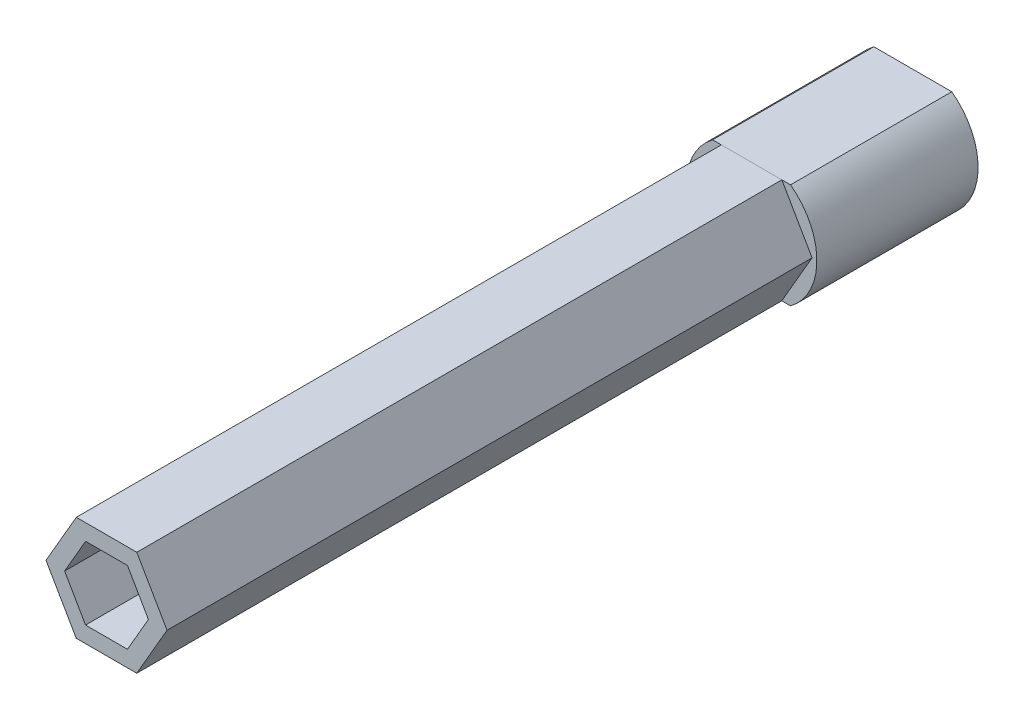
ISO-10303-21;
HEADER;
FILE_DESCRIPTION(('STEP AP214'),'2;1');
FILE_NAME('part.step','',(''),(''),'','','');
FILE_SCHEMA(('AUTOMOTIVE_DESIGN { 1 0 10303 214 1 1 1 1 }'));
ENDSEC;
DATA;
#1=APPLICATION_CONTEXT('core data for automotive mechanical design processes');
#2=APPLICATION_PROTOCOL_DEFINITION('international standard','automotive_design',2000,#1);
#3=PRODUCT_CONTEXT('',#1,'mechanical');
#4=PRODUCT('Part','Part','',(#3));
#5=PRODUCT_RELATED_PRODUCT_CATEGORY('part','',(#4));
#6=PRODUCT_DEFINITION_FORMATION('','',#4);
#7=PRODUCT_DEFINITION_CONTEXT('part definition',#1,'design');
#8=PRODUCT_DEFINITION('design','',#6,#7);
#9=PRODUCT_DEFINITION_SHAPE('','',#8);
#10=(LENGTH_UNIT() NAMED_UNIT(*) SI_UNIT(.MILLI.,.METRE.));
#11=(NAMED_UNIT(*) PLANE_ANGLE_UNIT() SI_UNIT($,.RADIAN.));
#12=(NAMED_UNIT(*) SI_UNIT($,.STERADIAN.) SOLID_ANGLE_UNIT());
#13=UNCERTAINTY_MEASURE_WITH_UNIT(LENGTH_MEASURE(1.E-05),#10,'distance_accuracy_value','');
#14=(GEOMETRIC_REPRESENTATION_CONTEXT(3) GLOBAL_UNCERTAINTY_ASSIGNED_CONTEXT((#13)) GLOBAL_UNIT_ASSIGNED_CONTEXT((#10,
#11,#12)) REPRESENTATION_CONTEXT('',''));
#15=CARTESIAN_POINT('',(0.,0.,0.));
#16=DIRECTION('',(0.,0.,1.));
#17=DIRECTION('',(1.,0.,0.));
#18=AXIS2_PLACEMENT_3D('',#15,#16,#17);
#19=CARTESIAN_POINT('',(0.,0.,10.));
#20=DIRECTION('',(0.,0.,1.));
#21=DIRECTION('',(1.,0.,0.));
#22=AXIS2_PLACEMENT_3D('',#19,#20,#21);
#23=PLANE('',#22);
#24=DIRECTION('',(0.500519628214266,0.865725188366524,0.));
#25=VECTOR('',#24,1.);
#26=CARTESIAN_POINT('',(1.29768760413523,-2.25077917221432,10.));
#27=LINE('',#26,#25);
#28=CARTESIAN_POINT('',(1.29768760413523,-2.25077917221432,10.));
#29=VERTEX_POINT('',#28);
#30=CARTESIAN_POINT('',(1.58721343572977,-1.75,10.));
#31=VERTEX_POINT('',#30);
#32=EDGE_CURVE('E255',#29,#31,#27,.T.);
#33=ORIENTED_EDGE('',*,*,#32,.T.);
#34=DIRECTION('',(-1.,0.,0.));
#35=VECTOR('',#34,1.);
#36=CARTESIAN_POINT('',(1.85472369909914,-1.75,10.));
#37=LINE('',#36,#35);
#38=CARTESIAN_POINT('',(-1.58821363394415,-1.75,10.));
#39=VERTEX_POINT('',#38);
#40=EDGE_CURVE('E216',#31,#39,#37,.T.);
#41=ORIENTED_EDGE('',*,*,#40,.T.);
#42=DIRECTION('',(0.499480191714345,-0.866325307309558,0.));
#43=VECTOR('',#42,1.);
#44=CARTESIAN_POINT('',(-2.59807574351413,0.00155915474988123,10.));
#45=LINE('',#44,#43);
#46=CARTESIAN_POINT('',(-1.30038813937889,-2.24922001746443,10.));
#47=VERTEX_POINT('',#46);
#48=EDGE_CURVE('E252',#39,#47,#45,.T.);
#49=ORIENTED_EDGE('',*,*,#48,.T.);
#50=DIRECTION('',(0.999999819928611,-0.000600118943034815,0.));
#51=VECTOR('',#50,1.);
#52=CARTESIAN_POINT('',(-1.30038813937889,-2.24922001746443,10.));
#53=LINE('',#52,#51);
#54=EDGE_CURVE('E273',#47,#29,#53,.T.);
#55=ORIENTED_EDGE('',*,*,#54,.T.);
#56=EDGE_LOOP('',(#33,#41,#49,#55));
#57=FACE_BOUND('',#56,.T.);
#58=ADVANCED_FACE('F45',(#57),#23,.T.);
#59=DIRECTION('',(-0.499480191714345,0.866325307309558,0.));
#60=VECTOR('',#59,1.);
#61=CARTESIAN_POINT('',(2.59807574351412,-0.00155915474988166,10.));
#62=LINE('',#61,#60);
#63=CARTESIAN_POINT('',(2.59807574351412,-0.00155915474988166,10.));
#64=VERTEX_POINT('',#63);
#65=CARTESIAN_POINT('',(2.54860817150372,0.084240062585808,10.));
#66=VERTEX_POINT('',#65);
#67=EDGE_CURVE('E283',#64,#66,#62,.T.);
#68=ORIENTED_EDGE('',*,*,#67,.T.);
#69=CARTESIAN_POINT('',(0.,0.,10.));
#70=DIRECTION('',(0.,0.,-1.));
#71=DIRECTION('',(-1.,0.,0.));
#72=AXIS2_PLACEMENT_3D('',#69,#70,#71);
#73=CIRCLE('',#72,2.55);
#74=CARTESIAN_POINT('',(2.5485052276818,-0.0872989374422718,10.));
#75=VERTEX_POINT('',#74);
#76=EDGE_CURVE('E675',#66,#75,#73,.T.);
#77=ORIENTED_EDGE('',*,*,#76,.T.);
#78=EDGE_CURVE('E276',#75,#64,#27,.T.);
#79=ORIENTED_EDGE('',*,*,#78,.T.);
#80=EDGE_LOOP('',(#68,#77,#79));
#81=FACE_BOUND('',#80,.T.);
#82=ADVANCED_FACE('F516',(#81),#23,.T.);
#83=DIRECTION('',(-0.500519628214266,-0.865725188366524,0.));
#84=VECTOR('',#83,1.);
#85=CARTESIAN_POINT('',(-1.29768760413523,2.25077917221431,10.));
#86=LINE('',#85,#84);
#87=CARTESIAN_POINT('',(-1.29768760413523,2.25077917221431,10.));
#88=VERTEX_POINT('',#87);
#89=CARTESIAN_POINT('',(-1.58721343572977,1.75,10.));
#90=VERTEX_POINT('',#89);
#91=EDGE_CURVE('E293',#88,#90,#86,.T.);
#92=ORIENTED_EDGE('',*,*,#91,.T.);
#93=DIRECTION('',(1.,0.,0.));
#94=VECTOR('',#93,1.);
#95=CARTESIAN_POINT('',(-1.85472369909914,1.75,10.));
#96=LINE('',#95,#94);
#97=CARTESIAN_POINT('',(1.58821363394415,1.75,10.));
#98=VERTEX_POINT('',#97);
#99=EDGE_CURVE('E236',#90,#98,#96,.T.);
#100=ORIENTED_EDGE('',*,*,#99,.T.);
#101=CARTESIAN_POINT('',(1.30038813937889,2.24922001746443,10.));
#102=VERTEX_POINT('',#101);
#103=EDGE_CURVE('E282',#98,#102,#62,.T.);
#104=ORIENTED_EDGE('',*,*,#103,.T.);
#105=DIRECTION('',(-0.999999819928611,0.000600118943034147,0.));
#106=VECTOR('',#105,1.);
#107=CARTESIAN_POINT('',(1.30038813937889,2.24922001746443,10.));
#108=LINE('',#107,#106);
#109=EDGE_CURVE('E287',#102,#88,#108,.T.);
#110=ORIENTED_EDGE('',*,*,#109,.T.);
#111=EDGE_LOOP('',(#92,#100,#104,#110));
#112=FACE_BOUND('',#111,.T.);
#113=ADVANCED_FACE('F523',(#112),#23,.T.);
#114=CARTESIAN_POINT('',(0.,0.,50.));
#115=DIRECTION('',(0.,0.,1.));
#116=DIRECTION('',(1.,0.,0.));
#117=AXIS2_PLACEMENT_3D('',#114,#115,#116);
#118=PLANE('',#117);
#119=DIRECTION('',(0.999999819928611,-0.000600118943034738,0.));
#120=VECTOR('',#119,1.);
#121=CARTESIAN_POINT('',(-1.87833842354729,-3.24887335855974,50.));
#122=LINE('',#121,#120);
#123=CARTESIAN_POINT('',(-1.87833842354729,-3.24887335855974,50.));
#124=VERTEX_POINT('',#123);
#125=CARTESIAN_POINT('',(1.87443765041756,-3.25112547097623,50.));
#126=VERTEX_POINT('',#125);
#127=EDGE_CURVE('E319',#124,#126,#122,.T.);
#128=ORIENTED_EDGE('',*,*,#127,.T.);
#129=DIRECTION('',(0.500519628214266,0.865725188366524,0.));
#130=VECTOR('',#129,1.);
#131=CARTESIAN_POINT('',(1.87443765041756,-3.25112547097623,50.));
#132=LINE('',#131,#130);
#133=CARTESIAN_POINT('',(3.75277607396485,-0.00225211241649553,50.));
#134=VERTEX_POINT('',#133);
#135=EDGE_CURVE('E323',#126,#134,#132,.T.);
#136=ORIENTED_EDGE('',*,*,#135,.T.);
#137=DIRECTION('',(-0.499480191714345,0.866325307309558,0.));
#138=VECTOR('',#137,1.);
#139=CARTESIAN_POINT('',(3.75277607396485,-0.00225211241649553,50.));
#140=LINE('',#139,#138);
#141=CARTESIAN_POINT('',(1.87833842354728,3.24887335855974,50.));
#142=VERTEX_POINT('',#141);
#143=EDGE_CURVE('E327',#134,#142,#140,.T.);
#144=ORIENTED_EDGE('',*,*,#143,.T.);
#145=DIRECTION('',(-0.999999819928611,0.000600118943034275,0.));
#146=VECTOR('',#145,1.);
#147=CARTESIAN_POINT('',(1.87833842354728,3.24887335855974,50.));
#148=LINE('',#147,#146);
#149=CARTESIAN_POINT('',(-1.87443765041756,3.25112547097623,50.));
#150=VERTEX_POINT('',#149);
#151=EDGE_CURVE('E330',#142,#150,#148,.T.);
#152=ORIENTED_EDGE('',*,*,#151,.T.);
#153=DIRECTION('',(-0.500519628214266,-0.865725188366524,0.));
#154=VECTOR('',#153,1.);
#155=CARTESIAN_POINT('',(-1.87443765041756,3.25112547097623,50.));
#156=LINE('',#155,#154);
#157=CARTESIAN_POINT('',(-3.75277607396485,0.0022521124164951,50.));
#158=VERTEX_POINT('',#157);
#159=EDGE_CURVE('E333',#150,#158,#156,.T.);
#160=ORIENTED_EDGE('',*,*,#159,.T.);
#161=DIRECTION('',(0.499480191714345,-0.866325307309558,0.));
#162=VECTOR('',#161,1.);
#163=CARTESIAN_POINT('',(-3.75277607396485,0.0022521124164951,50.));
#164=LINE('',#163,#162);
#165=EDGE_CURVE('E336',#158,#124,#164,.T.);
#166=ORIENTED_EDGE('',*,*,#165,.T.);
#167=EDGE_LOOP('',(#128,#136,#144,#152,#160,#166));
#168=FACE_BOUND('',#167,.T.);
#169=DIRECTION('',(-0.999999819928611,0.000600118943034815,0.));
#170=VECTOR('',#169,1.);
#171=CARTESIAN_POINT('',(-0.00135026762182833,-2.24999959483937,50.));
#172=LINE('',#171,#170);
#173=CARTESIAN_POINT('',(1.29768760413523,-2.25077917221432,50.));
#174=VERTEX_POINT('',#173);
#175=CARTESIAN_POINT('',(-1.30038813937889,-2.24922001746443,50.));
#176=VERTEX_POINT('',#175);
#177=EDGE_CURVE('E54',#174,#176,#172,.T.);
#178=ORIENTED_EDGE('',*,*,#177,.T.);
#179=DIRECTION('',(-0.499480191714345,0.866325307309558,0.));
#180=VECTOR('',#179,1.);
#181=CARTESIAN_POINT('',(-1.94923194144651,-1.12383043135728,50.));
#182=LINE('',#181,#180);
#183=CARTESIAN_POINT('',(-2.59807574351413,0.00155915474988123,50.));
#184=VERTEX_POINT('',#183);
#185=EDGE_CURVE('E11',#176,#184,#182,.T.);
#186=ORIENTED_EDGE('',*,*,#185,.T.);
#187=DIRECTION('',(0.500519628214266,0.865725188366524,0.));
#188=VECTOR('',#187,1.);
#189=CARTESIAN_POINT('',(-1.94788167382468,1.1261691634821,50.));
#190=LINE('',#189,#188);
#191=CARTESIAN_POINT('',(-1.29768760413523,2.25077917221431,50.));
#192=VERTEX_POINT('',#191);
#193=EDGE_CURVE('E415',#184,#192,#190,.T.);
#194=ORIENTED_EDGE('',*,*,#193,.T.);
#195=DIRECTION('',(0.999999819928611,-0.000600118943034147,0.));
#196=VECTOR('',#195,1.);
#197=CARTESIAN_POINT('',(0.00135026762182683,2.24999959483937,50.));
#198=LINE('',#197,#196);
#199=CARTESIAN_POINT('',(1.30038813937889,2.24922001746443,50.));
#200=VERTEX_POINT('',#199);
#201=EDGE_CURVE('E572',#192,#200,#198,.T.);
#202=ORIENTED_EDGE('',*,*,#201,.T.);
#203=DIRECTION('',(0.499480191714345,-0.866325307309558,0.));
#204=VECTOR('',#203,1.);
#205=CARTESIAN_POINT('',(1.94923194144651,1.12383043135728,50.));
#206=LINE('',#205,#204);
#207=CARTESIAN_POINT('',(2.59807574351412,-0.00155915474988166,50.));
#208=VERTEX_POINT('',#207);
#209=EDGE_CURVE('E568',#200,#208,#206,.T.);
#210=ORIENTED_EDGE('',*,*,#209,.T.);
#211=DIRECTION('',(-0.500519628214266,-0.865725188366524,0.));
#212=VECTOR('',#211,1.);
#213=CARTESIAN_POINT('',(1.94788167382468,-1.1261691634821,50.));
#214=LINE('',#213,#212);
#215=EDGE_CURVE('E563',#208,#174,#214,.T.);
#216=ORIENTED_EDGE('',*,*,#215,.T.);
#217=EDGE_LOOP('',(#178,#186,#194,#202,#210,#216));
#218=FACE_BOUND('',#217,.T.);
#219=ADVANCED_FACE('F539',(#168,#218),#118,.T.);
#220=CARTESIAN_POINT('',(0.,0.,10.));
#221=DIRECTION('',(0.,0.,1.));
#222=DIRECTION('',(1.,0.,0.));
#223=AXIS2_PLACEMENT_3D('',#220,#221,#222);
#224=PLANE('',#223);
#225=DIRECTION('',(0.499480191714345,-0.866325307309558,0.));
#226=VECTOR('',#225,1.);
#227=CARTESIAN_POINT('',(-3.75277607396485,0.0022521124164951,10.));
#228=LINE('',#227,#226);
#229=CARTESIAN_POINT('',(-3.75277607396485,0.00225211241649571,10.));
#230=VERTEX_POINT('',#229);
#231=CARTESIAN_POINT('',(-1.87813105049792,-3.24959271649905,10.));
#232=VERTEX_POINT('',#231);
#233=EDGE_CURVE('E324',#230,#232,#228,.T.);
#234=ORIENTED_EDGE('',*,*,#233,.F.);
#235=DIRECTION('',(-0.500519628214266,-0.865725188366524,0.));
#236=VECTOR('',#235,1.);
#237=CARTESIAN_POINT('',(-1.87443765041756,3.25112547097623,10.));
#238=LINE('',#237,#236);
#239=CARTESIAN_POINT('',(-1.87464549846826,3.25040646104057,10.));
#240=VERTEX_POINT('',#239);
#241=EDGE_CURVE('E605',#240,#230,#238,.T.);
#242=ORIENTED_EDGE('',*,*,#241,.F.);
#243=CARTESIAN_POINT('',(-1.87476299633689,3.25,10.));
#244=DIRECTION('',(-1.,0.,0.));
#245=VECTOR('',#244,1.);
#246=LINE('',#243,#245);
#247=CARTESIAN_POINT('',(-2.41660919471891,3.25,10.));
#248=VERTEX_POINT('',#247);
#249=EDGE_CURVE('E409',#240,#248,#246,.T.);
#250=ORIENTED_EDGE('',*,*,#249,.T.);
#251=CARTESIAN_POINT('',(0.,0.,10.));
#252=DIRECTION('',(0.,0.,1.));
#253=DIRECTION('',(1.,0.,0.));
#254=AXIS2_PLACEMENT_3D('',#251,#252,#253);
#255=CIRCLE('',#254,4.05);
#256=CARTESIAN_POINT('',(-2.41660919471891,-3.25,10.));
#257=VERTEX_POINT('',#256);
#258=EDGE_CURVE('E443',#248,#257,#255,.T.);
#259=ORIENTED_EDGE('',*,*,#258,.T.);
#260=CARTESIAN_POINT('',(-2.41660919471891,-3.25,10.));
#261=DIRECTION('',(1.,0.,0.));
#262=VECTOR('',#261,1.);
#263=LINE('',#260,#262);
#264=EDGE_CURVE('E466',#257,#232,#263,.T.);
#265=ORIENTED_EDGE('',*,*,#264,.T.);
#266=EDGE_LOOP('',(#234,#242,#250,#259,#265));
#267=FACE_BOUND('',#266,.T.);
#268=ADVANCED_FACE('F380',(#267),#224,.T.);
#269=CARTESIAN_POINT('',(0.,0.,10.));
#270=DIRECTION('',(0.,0.,-1.));
#271=DIRECTION('',(-1.,0.,0.));
#272=AXIS2_PLACEMENT_3D('',#269,#270,#271);
#273=CYLINDRICAL_SURFACE('',#272,4.05);
#274=CARTESIAN_POINT('',(0.,0.,0.));
#275=DIRECTION('',(0.,0.,1.));
#276=DIRECTION('',(1.,0.,0.));
#277=AXIS2_PLACEMENT_3D('',#274,#275,#276);
#278=CIRCLE('',#277,4.05);
#279=CARTESIAN_POINT('',(-2.41660919471891,3.25,0.));
#280=VERTEX_POINT('',#279);
#281=CARTESIAN_POINT('',(-2.41660919471891,-3.25,0.));
#282=VERTEX_POINT('',#281);
#283=EDGE_CURVE('E473',#280,#282,#278,.T.);
#284=ORIENTED_EDGE('',*,*,#283,.T.);
#285=DIRECTION('',(0.,0.,-1.));
#286=VECTOR('',#285,1.);
#287=CARTESIAN_POINT('',(-2.41660919471891,-3.25,10.));
#288=LINE('',#287,#286);
#289=EDGE_CURVE('E575',#257,#282,#288,.T.);
#290=ORIENTED_EDGE('',*,*,#289,.F.);
#291=ORIENTED_EDGE('',*,*,#258,.F.);
#292=DIRECTION('',(0.,0.,-1.));
#293=VECTOR('',#292,1.);
#294=CARTESIAN_POINT('',(-2.41660919471891,3.25,10.));
#295=LINE('',#294,#293);
#296=EDGE_CURVE('E635',#248,#280,#295,.T.);
#297=ORIENTED_EDGE('',*,*,#296,.T.);
#298=EDGE_LOOP('',(#284,#290,#291,#297));
#299=FACE_BOUND('',#298,.T.);
#300=ADVANCED_FACE('F47',(#299),#273,.T.);
#301=CARTESIAN_POINT('',(-2.41660919471891,-3.25,10.));
#302=DIRECTION('',(0.,1.,0.));
#303=DIRECTION('',(0.,0.,1.));
#304=AXIS2_PLACEMENT_3D('',#301,#302,#303);
#305=PLANE('',#304);
#306=DIRECTION('',(1.,0.,0.));
#307=VECTOR('',#306,1.);
#308=CARTESIAN_POINT('',(-2.41660919471891,-3.25,0.));
#309=LINE('',#308,#307);
#310=CARTESIAN_POINT('',(2.41660919471891,-3.25,0.));
#311=VERTEX_POINT('',#310);
#312=EDGE_CURVE('E477',#282,#311,#309,.T.);
#313=ORIENTED_EDGE('',*,*,#312,.T.);
#314=DIRECTION('',(0.,0.,-1.));
#315=VECTOR('',#314,1.);
#316=CARTESIAN_POINT('',(2.41660919471891,-3.25,10.));
#317=LINE('',#316,#315);
#318=CARTESIAN_POINT('',(2.41660919471891,-3.25,10.));
#319=VERTEX_POINT('',#318);
#320=EDGE_CURVE('E463',#319,#311,#317,.T.);
#321=ORIENTED_EDGE('',*,*,#320,.F.);
#322=CARTESIAN_POINT('',(1.87476299633689,-3.25,10.));
#323=DIRECTION('',(1.,0.,0.));
#324=VECTOR('',#323,1.);
#325=LINE('',#322,#324);
#326=CARTESIAN_POINT('',(1.87464549846826,-3.25040646104057,10.));
#327=VERTEX_POINT('',#326);
#328=EDGE_CURVE('E459',#327,#319,#325,.T.);
#329=ORIENTED_EDGE('',*,*,#328,.F.);
#330=CARTESIAN_POINT('',(-1.87833842354729,-3.24887335855974,9.99999999999999));
#331=DIRECTION('',(0.999999819928611,-0.000600118943034738,0.));
#332=VECTOR('',#331,1.);
#333=LINE('',#330,#332);
#334=EDGE_CURVE('E318',#232,#327,#333,.T.);
#335=ORIENTED_EDGE('',*,*,#334,.F.);
#336=ORIENTED_EDGE('',*,*,#264,.F.);
#337=ORIENTED_EDGE('',*,*,#289,.T.);
#338=EDGE_LOOP('',(#313,#321,#329,#335,#336,#337));
#339=FACE_BOUND('',#338,.T.);
#340=ADVANCED_FACE('F434',(#339),#305,.F.);
#341=CARTESIAN_POINT('',(0.,0.,10.));
#342=DIRECTION('',(0.,0.,-1.));
#343=DIRECTION('',(-1.,0.,0.));
#344=AXIS2_PLACEMENT_3D('',#341,#342,#343);
#345=CYLINDRICAL_SURFACE('',#344,4.05);
#346=CARTESIAN_POINT('',(0.,0.,0.));
#347=DIRECTION('',(0.,0.,1.));
#348=DIRECTION('',(1.,0.,0.));
#349=AXIS2_PLACEMENT_3D('',#346,#347,#348);
#350=CIRCLE('',#349,4.05);
#351=CARTESIAN_POINT('',(2.41660919471891,3.25,0.));
#352=VERTEX_POINT('',#351);
#353=EDGE_CURVE('E627',#311,#352,#350,.T.);
#354=ORIENTED_EDGE('',*,*,#353,.T.);
#355=DIRECTION('',(0.,0.,-1.));
#356=VECTOR('',#355,1.);
#357=CARTESIAN_POINT('',(2.41660919471891,3.25,10.));
#358=LINE('',#357,#356);
#359=CARTESIAN_POINT('',(2.41660919471891,3.25,10.));
#360=VERTEX_POINT('',#359);
#361=EDGE_CURVE('E420',#360,#352,#358,.T.);
#362=ORIENTED_EDGE('',*,*,#361,.F.);
#363=CARTESIAN_POINT('',(0.,0.,10.));
#364=DIRECTION('',(0.,0.,1.));
#365=DIRECTION('',(1.,0.,0.));
#366=AXIS2_PLACEMENT_3D('',#363,#364,#365);
#367=CIRCLE('',#366,4.05);
#368=EDGE_CURVE('E588',#319,#360,#367,.T.);
#369=ORIENTED_EDGE('',*,*,#368,.F.);
#370=ORIENTED_EDGE('',*,*,#320,.T.);
#371=EDGE_LOOP('',(#354,#362,#369,#370));
#372=FACE_BOUND('',#371,.T.);
#373=ADVANCED_FACE('F432',(#372),#345,.T.);
#374=CARTESIAN_POINT('',(-2.41660919471891,3.25,10.));
#375=DIRECTION('',(0.,-1.,0.));
#376=DIRECTION('',(0.,0.,-1.));
#377=AXIS2_PLACEMENT_3D('',#374,#375,#376);
#378=PLANE('',#377);
#379=DIRECTION('',(-1.,0.,0.));
#380=VECTOR('',#379,1.);
#381=CARTESIAN_POINT('',(-2.41660919471891,3.25,0.));
#382=LINE('',#381,#380);
#383=EDGE_CURVE('E629',#352,#280,#382,.T.);
#384=ORIENTED_EDGE('',*,*,#383,.T.);
#385=ORIENTED_EDGE('',*,*,#296,.F.);
#386=ORIENTED_EDGE('',*,*,#249,.F.);
#387=CARTESIAN_POINT('',(1.87833842354728,3.24887335855974,9.99999999999999));
#388=DIRECTION('',(-0.999999819928611,0.000600118943034275,0.));
#389=VECTOR('',#388,1.);
#390=LINE('',#387,#389);
#391=CARTESIAN_POINT('',(1.87813105049792,3.24959271649905,10.));
#392=VERTEX_POINT('',#391);
#393=EDGE_CURVE('E489',#392,#240,#390,.T.);
#394=ORIENTED_EDGE('',*,*,#393,.F.);
#395=CARTESIAN_POINT('',(2.41660919471891,3.25,10.));
#396=DIRECTION('',(-1.,0.,0.));
#397=VECTOR('',#396,1.);
#398=LINE('',#395,#397);
#399=EDGE_CURVE('E594',#360,#392,#398,.T.);
#400=ORIENTED_EDGE('',*,*,#399,.F.);
#401=ORIENTED_EDGE('',*,*,#361,.T.);
#402=EDGE_LOOP('',(#384,#385,#386,#394,#400,#401));
#403=FACE_BOUND('',#402,.T.);
#404=ADVANCED_FACE('F378',(#403),#378,.F.);
#405=DIRECTION('',(-0.499480191714345,0.866325307309558,0.));
#406=VECTOR('',#405,1.);
#407=CARTESIAN_POINT('',(3.75277607396485,-0.00225211241649553,10.));
#408=LINE('',#407,#406);
#409=CARTESIAN_POINT('',(3.75277607396485,-0.00225211241649553,10.));
#410=VERTEX_POINT('',#409);
#411=EDGE_CURVE('E495',#410,#392,#408,.T.);
#412=ORIENTED_EDGE('',*,*,#411,.F.);
#413=DIRECTION('',(0.500519628214266,0.865725188366524,0.));
#414=VECTOR('',#413,1.);
#415=CARTESIAN_POINT('',(1.87443765041756,-3.25112547097623,10.));
#416=LINE('',#415,#414);
#417=EDGE_CURVE('E470',#327,#410,#416,.T.);
#418=ORIENTED_EDGE('',*,*,#417,.F.);
#419=ORIENTED_EDGE('',*,*,#328,.T.);
#420=ORIENTED_EDGE('',*,*,#368,.T.);
#421=ORIENTED_EDGE('',*,*,#399,.T.);
#422=EDGE_LOOP('',(#412,#418,#419,#420,#421));
#423=FACE_BOUND('',#422,.T.);
#424=ADVANCED_FACE('F374',(#423),#224,.T.);
#425=CARTESIAN_POINT('',(0.,0.,0.));
#426=DIRECTION('',(0.,0.,1.));
#427=DIRECTION('',(1.,0.,0.));
#428=AXIS2_PLACEMENT_3D('',#425,#426,#427);
#429=PLANE('',#428);
#430=CARTESIAN_POINT('',(0.,0.,0.));
#431=DIRECTION('',(0.,0.,-1.));
#432=DIRECTION('',(-1.,0.,0.));
#433=AXIS2_PLACEMENT_3D('',#430,#431,#432);
#434=CIRCLE('',#433,2.55);
#435=CARTESIAN_POINT('',(-1.85472369909914,-1.75,0.));
#436=VERTEX_POINT('',#435);
#437=CARTESIAN_POINT('',(-1.85472369909914,1.75,0.));
#438=VERTEX_POINT('',#437);
#439=EDGE_CURVE('E648',#436,#438,#434,.T.);
#440=ORIENTED_EDGE('',*,*,#439,.F.);
#441=DIRECTION('',(-1.,0.,0.));
#442=VECTOR('',#441,1.);
#443=CARTESIAN_POINT('',(1.85472369909914,-1.75,0.));
#444=LINE('',#443,#442);
#445=CARTESIAN_POINT('',(1.85472369909914,-1.75,0.));
#446=VERTEX_POINT('',#445);
#447=EDGE_CURVE('E69',#446,#436,#444,.T.);
#448=ORIENTED_EDGE('',*,*,#447,.F.);
#449=CARTESIAN_POINT('',(0.,0.,0.));
#450=DIRECTION('',(0.,0.,-1.));
#451=DIRECTION('',(-1.,0.,0.));
#452=AXIS2_PLACEMENT_3D('',#449,#450,#451);
#453=CIRCLE('',#452,2.55);
#454=CARTESIAN_POINT('',(1.85472369909914,1.75,0.));
#455=VERTEX_POINT('',#454);
#456=EDGE_CURVE('E217',#455,#446,#453,.T.);
#457=ORIENTED_EDGE('',*,*,#456,.F.);
#458=DIRECTION('',(1.,0.,0.));
#459=VECTOR('',#458,1.);
#460=CARTESIAN_POINT('',(-1.85472369909914,1.75,0.));
#461=LINE('',#460,#459);
#462=EDGE_CURVE('E651',#438,#455,#461,.T.);
#463=ORIENTED_EDGE('',*,*,#462,.F.);
#464=EDGE_LOOP('',(#440,#448,#457,#463));
#465=FACE_BOUND('',#464,.T.);
#466=ORIENTED_EDGE('',*,*,#283,.F.);
#467=ORIENTED_EDGE('',*,*,#383,.F.);
#468=ORIENTED_EDGE('',*,*,#353,.F.);
#469=ORIENTED_EDGE('',*,*,#312,.F.);
#470=EDGE_LOOP('',(#466,#467,#468,#469));
#471=FACE_BOUND('',#470,.T.);
#472=ADVANCED_FACE('F372',(#465,#471),#429,.F.);
#473=CARTESIAN_POINT('',(-1.87833842354729,-3.24887335855974,50.));
#474=DIRECTION('',(0.000600118943034738,0.999999819928611,0.));
#475=DIRECTION('',(-0.999999819928611,0.000600118943034738,0.));
#476=AXIS2_PLACEMENT_3D('',#473,#474,#475);
#477=PLANE('',#476);
#478=ORIENTED_EDGE('',*,*,#334,.T.);
#479=DIRECTION('',(0.,0.,-1.));
#480=VECTOR('',#479,1.);
#481=CARTESIAN_POINT('',(1.87443765041756,-3.25112547097623,50.));
#482=LINE('',#481,#480);
#483=EDGE_CURVE('E349',#126,#327,#482,.T.);
#484=ORIENTED_EDGE('',*,*,#483,.F.);
#485=ORIENTED_EDGE('',*,*,#127,.F.);
#486=DIRECTION('',(0.,0.,-1.));
#487=VECTOR('',#486,1.);
#488=CARTESIAN_POINT('',(-1.87833842354729,-3.24887335855974,50.));
#489=LINE('',#488,#487);
#490=EDGE_CURVE('E339',#124,#232,#489,.T.);
#491=ORIENTED_EDGE('',*,*,#490,.T.);
#492=EDGE_LOOP('',(#478,#484,#485,#491));
#493=FACE_BOUND('',#492,.T.);
#494=ADVANCED_FACE('F361',(#493),#477,.F.);
#495=CARTESIAN_POINT('',(1.87443765041756,-3.25112547097623,50.));
#496=DIRECTION('',(-0.865725188366524,0.500519628214266,0.));
#497=DIRECTION('',(-0.500519628214266,-0.865725188366524,0.));
#498=AXIS2_PLACEMENT_3D('',#495,#496,#497);
#499=PLANE('',#498);
#500=ORIENTED_EDGE('',*,*,#417,.T.);
#501=DIRECTION('',(0.,0.,-1.));
#502=VECTOR('',#501,1.);
#503=CARTESIAN_POINT('',(3.75277607396485,-0.00225211241649553,50.));
#504=LINE('',#503,#502);
#505=EDGE_CURVE('E345',#134,#410,#504,.T.);
#506=ORIENTED_EDGE('',*,*,#505,.F.);
#507=ORIENTED_EDGE('',*,*,#135,.F.);
#508=ORIENTED_EDGE('',*,*,#483,.T.);
#509=EDGE_LOOP('',(#500,#506,#507,#508));
#510=FACE_BOUND('',#509,.T.);
#511=ADVANCED_FACE('F371',(#510),#499,.F.);
#512=CARTESIAN_POINT('',(3.75277607396485,-0.00225211241649553,50.));
#513=DIRECTION('',(-0.866325307309558,-0.499480191714345,0.));
#514=DIRECTION('',(0.499480191714345,-0.866325307309559,0.));
#515=AXIS2_PLACEMENT_3D('',#512,#513,#514);
#516=PLANE('',#515);
#517=ORIENTED_EDGE('',*,*,#411,.T.);
#518=DIRECTION('',(0.,0.,-1.));
#519=VECTOR('',#518,1.);
#520=CARTESIAN_POINT('',(1.87833842354728,3.24887335855974,50.));
#521=LINE('',#520,#519);
#522=EDGE_CURVE('E350',#142,#392,#521,.T.);
#523=ORIENTED_EDGE('',*,*,#522,.F.);
#524=ORIENTED_EDGE('',*,*,#143,.F.);
#525=ORIENTED_EDGE('',*,*,#505,.T.);
#526=EDGE_LOOP('',(#517,#523,#524,#525));
#527=FACE_BOUND('',#526,.T.);
#528=ADVANCED_FACE('F507',(#527),#516,.F.);
#529=CARTESIAN_POINT('',(1.87833842354728,3.24887335855974,50.));
#530=DIRECTION('',(-0.000600118943034275,-0.999999819928611,0.));
#531=DIRECTION('',(0.999999819928611,-0.000600118943034275,0.));
#532=AXIS2_PLACEMENT_3D('',#529,#530,#531);
#533=PLANE('',#532);
#534=ORIENTED_EDGE('',*,*,#393,.T.);
#535=DIRECTION('',(0.,0.,-1.));
#536=VECTOR('',#535,1.);
#537=CARTESIAN_POINT('',(-1.87443765041756,3.25112547097623,50.));
#538=LINE('',#537,#536);
#539=EDGE_CURVE('E344',#150,#240,#538,.T.);
#540=ORIENTED_EDGE('',*,*,#539,.F.);
#541=ORIENTED_EDGE('',*,*,#151,.F.);
#542=ORIENTED_EDGE('',*,*,#522,.T.);
#543=EDGE_LOOP('',(#534,#540,#541,#542));
#544=FACE_BOUND('',#543,.T.);
#545=ADVANCED_FACE('F497',(#544),#533,.F.);
#546=CARTESIAN_POINT('',(-1.87443765041756,3.25112547097623,50.));
#547=DIRECTION('',(0.865725188366524,-0.500519628214266,0.));
#548=DIRECTION('',(0.500519628214266,0.865725188366524,0.));
#549=AXIS2_PLACEMENT_3D('',#546,#547,#548);
#550=PLANE('',#549);
#551=ORIENTED_EDGE('',*,*,#241,.T.);
#552=DIRECTION('',(0.,0.,-1.));
#553=VECTOR('',#552,1.);
#554=CARTESIAN_POINT('',(-3.75277607396485,0.0022521124164951,50.));
#555=LINE('',#554,#553);
#556=EDGE_CURVE('E340',#158,#230,#555,.T.);
#557=ORIENTED_EDGE('',*,*,#556,.F.);
#558=ORIENTED_EDGE('',*,*,#159,.F.);
#559=ORIENTED_EDGE('',*,*,#539,.T.);
#560=EDGE_LOOP('',(#551,#557,#558,#559));
#561=FACE_BOUND('',#560,.T.);
#562=ADVANCED_FACE('F506',(#561),#550,.F.);
#563=CARTESIAN_POINT('',(-3.75277607396485,0.0022521124164951,50.));
#564=DIRECTION('',(0.866325307309558,0.499480191714345,0.));
#565=DIRECTION('',(-0.499480191714345,0.866325307309559,0.));
#566=AXIS2_PLACEMENT_3D('',#563,#564,#565);
#567=PLANE('',#566);
#568=ORIENTED_EDGE('',*,*,#233,.T.);
#569=ORIENTED_EDGE('',*,*,#490,.F.);
#570=ORIENTED_EDGE('',*,*,#165,.F.);
#571=ORIENTED_EDGE('',*,*,#556,.T.);
#572=EDGE_LOOP('',(#568,#569,#570,#571));
#573=FACE_BOUND('',#572,.T.);
#574=ADVANCED_FACE('F601',(#573),#567,.F.);
#575=CARTESIAN_POINT('',(-2.59807574351413,0.00155915474988123,50.000025));
#576=DIRECTION('',(0.866325307309558,0.499480191714345,0.));
#577=DIRECTION('',(-0.499480191714345,0.866325307309558,0.));
#578=AXIS2_PLACEMENT_3D('',#575,#576,#577);
#579=PLANE('',#578);
#580=DIRECTION('',(0.,0.,-1.));
#581=VECTOR('',#580,1.);
#582=CARTESIAN_POINT('',(-1.30038813937889,-2.24922001746443,50.000025));
#583=LINE('',#582,#581);
#584=EDGE_CURVE('E261',#176,#47,#583,.T.);
#585=ORIENTED_EDGE('',*,*,#584,.T.);
#586=ORIENTED_EDGE('',*,*,#48,.F.);
#587=CARTESIAN_POINT('',(-2.54860817150372,-0.0842400625858095,10.));
#588=VERTEX_POINT('',#587);
#589=EDGE_CURVE('E213',#588,#39,#45,.T.);
#590=ORIENTED_EDGE('',*,*,#589,.F.);
#591=CARTESIAN_POINT('',(-2.59807574351413,0.00155915474988123,10.));
#592=VERTEX_POINT('',#591);
#593=EDGE_CURVE('E266',#592,#588,#45,.T.);
#594=ORIENTED_EDGE('',*,*,#593,.F.);
#595=DIRECTION('',(0.,0.,-1.));
#596=VECTOR('',#595,1.);
#597=CARTESIAN_POINT('',(-2.59807574351413,0.00155915474988123,50.000025));
#598=LINE('',#597,#596);
#599=EDGE_CURVE('E297',#184,#592,#598,.T.);
#600=ORIENTED_EDGE('',*,*,#599,.F.);
#601=ORIENTED_EDGE('',*,*,#185,.F.);
#602=EDGE_LOOP('',(#585,#586,#590,#594,#600,#601));
#603=FACE_BOUND('',#602,.T.);
#604=ADVANCED_FACE('F257',(#603),#579,.T.);
#605=CARTESIAN_POINT('',(-1.30038813937889,-2.24922001746443,50.000025));
#606=DIRECTION('',(0.000600118943034815,0.999999819928611,0.));
#607=DIRECTION('',(-0.999999819928611,0.000600118943034815,0.));
#608=AXIS2_PLACEMENT_3D('',#605,#606,#607);
#609=PLANE('',#608);
#610=DIRECTION('',(0.,0.,-1.));
#611=VECTOR('',#610,1.);
#612=CARTESIAN_POINT('',(1.29768760413523,-2.25077917221432,50.000025));
#613=LINE('',#612,#611);
#614=EDGE_CURVE('E313',#174,#29,#613,.T.);
#615=ORIENTED_EDGE('',*,*,#614,.T.);
#616=ORIENTED_EDGE('',*,*,#54,.F.);
#617=ORIENTED_EDGE('',*,*,#584,.F.);
#618=ORIENTED_EDGE('',*,*,#177,.F.);
#619=EDGE_LOOP('',(#615,#616,#617,#618));
#620=FACE_BOUND('',#619,.T.);
#621=ADVANCED_FACE('F705',(#620),#609,.T.);
#622=CARTESIAN_POINT('',(1.29768760413523,-2.25077917221432,50.000025));
#623=DIRECTION('',(-0.865725188366523,0.500519628214266,0.));
#624=DIRECTION('',(-0.500519628214266,-0.865725188366524,0.));
#625=AXIS2_PLACEMENT_3D('',#622,#623,#624);
#626=PLANE('',#625);
#627=DIRECTION('',(0.,0.,-1.));
#628=VECTOR('',#627,1.);
#629=CARTESIAN_POINT('',(2.59807574351412,-0.00155915474988166,50.000025));
#630=LINE('',#629,#628);
#631=EDGE_CURVE('E309',#208,#64,#630,.T.);
#632=ORIENTED_EDGE('',*,*,#631,.T.);
#633=ORIENTED_EDGE('',*,*,#78,.F.);
#634=EDGE_CURVE('E278',#31,#75,#27,.T.);
#635=ORIENTED_EDGE('',*,*,#634,.F.);
#636=ORIENTED_EDGE('',*,*,#32,.F.);
#637=ORIENTED_EDGE('',*,*,#614,.F.);
#638=ORIENTED_EDGE('',*,*,#215,.F.);
#639=EDGE_LOOP('',(#632,#633,#635,#636,#637,#638));
#640=FACE_BOUND('',#639,.T.);
#641=ADVANCED_FACE('F688',(#640),#626,.T.);
#642=CARTESIAN_POINT('',(2.59807574351412,-0.00155915474988166,50.000025));
#643=DIRECTION('',(-0.866325307309558,-0.499480191714345,0.));
#644=DIRECTION('',(0.499480191714345,-0.866325307309558,0.));
#645=AXIS2_PLACEMENT_3D('',#642,#643,#644);
#646=PLANE('',#645);
#647=DIRECTION('',(0.,0.,-1.));
#648=VECTOR('',#647,1.);
#649=CARTESIAN_POINT('',(1.30038813937889,2.24922001746443,50.000025));
#650=LINE('',#649,#648);
#651=EDGE_CURVE('E305',#200,#102,#650,.T.);
#652=ORIENTED_EDGE('',*,*,#651,.T.);
#653=ORIENTED_EDGE('',*,*,#103,.F.);
#654=EDGE_CURVE('E288',#66,#98,#62,.T.);
#655=ORIENTED_EDGE('',*,*,#654,.F.);
#656=ORIENTED_EDGE('',*,*,#67,.F.);
#657=ORIENTED_EDGE('',*,*,#631,.F.);
#658=ORIENTED_EDGE('',*,*,#209,.F.);
#659=EDGE_LOOP('',(#652,#653,#655,#656,#657,#658));
#660=FACE_BOUND('',#659,.T.);
#661=ADVANCED_FACE('F691',(#660),#646,.T.);
#662=CARTESIAN_POINT('',(1.30038813937889,2.24922001746443,50.000025));
#663=DIRECTION('',(-0.000600118943034147,-0.999999819928611,0.));
#664=DIRECTION('',(0.999999819928611,-0.000600118943034147,0.));
#665=AXIS2_PLACEMENT_3D('',#662,#663,#664);
#666=PLANE('',#665);
#667=DIRECTION('',(0.,0.,-1.));
#668=VECTOR('',#667,1.);
#669=CARTESIAN_POINT('',(-1.29768760413523,2.25077917221431,50.000025));
#670=LINE('',#669,#668);
#671=EDGE_CURVE('E302',#192,#88,#670,.T.);
#672=ORIENTED_EDGE('',*,*,#671,.T.);
#673=ORIENTED_EDGE('',*,*,#109,.F.);
#674=ORIENTED_EDGE('',*,*,#651,.F.);
#675=ORIENTED_EDGE('',*,*,#201,.F.);
#676=EDGE_LOOP('',(#672,#673,#674,#675));
#677=FACE_BOUND('',#676,.T.);
#678=ADVANCED_FACE('F536',(#677),#666,.T.);
#679=CARTESIAN_POINT('',(-1.29768760413523,2.25077917221431,50.000025));
#680=DIRECTION('',(0.865725188366524,-0.500519628214266,0.));
#681=DIRECTION('',(0.500519628214266,0.865725188366524,0.));
#682=AXIS2_PLACEMENT_3D('',#679,#680,#681);
#683=PLANE('',#682);
#684=ORIENTED_EDGE('',*,*,#599,.T.);
#685=CARTESIAN_POINT('',(-2.5485052276818,0.0872989374422735,10.));
#686=VERTEX_POINT('',#685);
#687=EDGE_CURVE('E292',#686,#592,#86,.T.);
#688=ORIENTED_EDGE('',*,*,#687,.F.);
#689=EDGE_CURVE('E298',#90,#686,#86,.T.);
#690=ORIENTED_EDGE('',*,*,#689,.F.);
#691=ORIENTED_EDGE('',*,*,#91,.F.);
#692=ORIENTED_EDGE('',*,*,#671,.F.);
#693=ORIENTED_EDGE('',*,*,#193,.F.);
#694=EDGE_LOOP('',(#684,#688,#690,#691,#692,#693));
#695=FACE_BOUND('',#694,.T.);
#696=ADVANCED_FACE('F528',(#695),#683,.T.);
#697=ORIENTED_EDGE('',*,*,#593,.T.);
#698=CARTESIAN_POINT('',(0.,0.,10.));
#699=DIRECTION('',(0.,0.,-1.));
#700=DIRECTION('',(-1.,0.,0.));
#701=AXIS2_PLACEMENT_3D('',#698,#699,#700);
#702=CIRCLE('',#701,2.55);
#703=EDGE_CURVE('E230',#588,#686,#702,.T.);
#704=ORIENTED_EDGE('',*,*,#703,.T.);
#705=ORIENTED_EDGE('',*,*,#687,.T.);
#706=EDGE_LOOP('',(#697,#704,#705));
#707=FACE_BOUND('',#706,.T.);
#708=ADVANCED_FACE('F518',(#707),#23,.T.);
#709=CARTESIAN_POINT('',(0.,0.,10.));
#710=DIRECTION('',(0.,0.,-1.));
#711=DIRECTION('',(-1.,0.,0.));
#712=AXIS2_PLACEMENT_3D('',#709,#710,#711);
#713=PLANE('',#712);
#714=ORIENTED_EDGE('',*,*,#589,.T.);
#715=CARTESIAN_POINT('',(-1.85472369909914,-1.75,10.));
#716=VERTEX_POINT('',#715);
#717=EDGE_CURVE('E208',#39,#716,#37,.T.);
#718=ORIENTED_EDGE('',*,*,#717,.T.);
#719=EDGE_CURVE('E211',#716,#588,#702,.T.);
#720=ORIENTED_EDGE('',*,*,#719,.T.);
#721=EDGE_LOOP('',(#714,#718,#720));
#722=FACE_BOUND('',#721,.T.);
#723=ADVANCED_FACE('F209',(#722),#713,.T.);
#724=ORIENTED_EDGE('',*,*,#634,.T.);
#725=CARTESIAN_POINT('',(1.85472369909914,-1.75,10.));
#726=VERTEX_POINT('',#725);
#727=EDGE_CURVE('E672',#75,#726,#73,.T.);
#728=ORIENTED_EDGE('',*,*,#727,.T.);
#729=EDGE_CURVE('E219',#726,#31,#37,.T.);
#730=ORIENTED_EDGE('',*,*,#729,.T.);
#731=EDGE_LOOP('',(#724,#728,#730));
#732=FACE_BOUND('',#731,.T.);
#733=ADVANCED_FACE('F533',(#732),#713,.T.);
#734=ORIENTED_EDGE('',*,*,#654,.T.);
#735=CARTESIAN_POINT('',(1.85472369909914,1.75,10.));
#736=VERTEX_POINT('',#735);
#737=EDGE_CURVE('E232',#98,#736,#96,.T.);
#738=ORIENTED_EDGE('',*,*,#737,.T.);
#739=EDGE_CURVE('E226',#736,#66,#73,.T.);
#740=ORIENTED_EDGE('',*,*,#739,.T.);
#741=EDGE_LOOP('',(#734,#738,#740));
#742=FACE_BOUND('',#741,.T.);
#743=ADVANCED_FACE('F847',(#742),#713,.T.);
#744=ORIENTED_EDGE('',*,*,#689,.T.);
#745=CARTESIAN_POINT('',(-1.85472369909914,1.75,10.));
#746=VERTEX_POINT('',#745);
#747=EDGE_CURVE('E61',#686,#746,#702,.T.);
#748=ORIENTED_EDGE('',*,*,#747,.T.);
#749=EDGE_CURVE('E238',#746,#90,#96,.T.);
#750=ORIENTED_EDGE('',*,*,#749,.T.);
#751=EDGE_LOOP('',(#744,#748,#750));
#752=FACE_BOUND('',#751,.T.);
#753=ADVANCED_FACE('F535',(#752),#713,.T.);
#754=CARTESIAN_POINT('',(1.85472369909914,-1.75,10.));
#755=DIRECTION('',(0.,-1.,0.));
#756=DIRECTION('',(0.,0.,-1.));
#757=AXIS2_PLACEMENT_3D('',#754,#755,#756);
#758=PLANE('',#757);
#759=ORIENTED_EDGE('',*,*,#447,.T.);
#760=DIRECTION('',(0.,0.,-1.));
#761=VECTOR('',#760,1.);
#762=CARTESIAN_POINT('',(-1.85472369909914,-1.75,10.));
#763=LINE('',#762,#761);
#764=EDGE_CURVE('E220',#716,#436,#763,.T.);
#765=ORIENTED_EDGE('',*,*,#764,.F.);
#766=ORIENTED_EDGE('',*,*,#717,.F.);
#767=ORIENTED_EDGE('',*,*,#40,.F.);
#768=ORIENTED_EDGE('',*,*,#729,.F.);
#769=DIRECTION('',(0.,0.,-1.));
#770=VECTOR('',#769,1.);
#771=CARTESIAN_POINT('',(1.85472369909914,-1.75,10.));
#772=LINE('',#771,#770);
#773=EDGE_CURVE('E264',#726,#446,#772,.T.);
#774=ORIENTED_EDGE('',*,*,#773,.T.);
#775=EDGE_LOOP('',(#759,#765,#766,#767,#768,#774));
#776=FACE_BOUND('',#775,.T.);
#777=ADVANCED_FACE('F221',(#776),#758,.F.);
#778=CARTESIAN_POINT('',(0.,0.,10.));
#779=DIRECTION('',(0.,0.,-1.));
#780=DIRECTION('',(-1.,0.,0.));
#781=AXIS2_PLACEMENT_3D('',#778,#779,#780);
#782=CYLINDRICAL_SURFACE('',#781,2.55);
#783=ORIENTED_EDGE('',*,*,#456,.T.);
#784=ORIENTED_EDGE('',*,*,#773,.F.);
#785=ORIENTED_EDGE('',*,*,#727,.F.);
#786=ORIENTED_EDGE('',*,*,#76,.F.);
#787=ORIENTED_EDGE('',*,*,#739,.F.);
#788=DIRECTION('',(0.,0.,-1.));
#789=VECTOR('',#788,1.);
#790=CARTESIAN_POINT('',(1.85472369909914,1.75,10.));
#791=LINE('',#790,#789);
#792=EDGE_CURVE('E269',#736,#455,#791,.T.);
#793=ORIENTED_EDGE('',*,*,#792,.T.);
#794=EDGE_LOOP('',(#783,#784,#785,#786,#787,#793));
#795=FACE_BOUND('',#794,.T.);
#796=ADVANCED_FACE('F866',(#795),#782,.F.);
#797=CARTESIAN_POINT('',(-1.85472369909914,1.75,10.));
#798=DIRECTION('',(0.,1.,0.));
#799=DIRECTION('',(-1.,0.,0.));
#800=AXIS2_PLACEMENT_3D('',#797,#798,#799);
#801=PLANE('',#800);
#802=ORIENTED_EDGE('',*,*,#462,.T.);
#803=ORIENTED_EDGE('',*,*,#792,.F.);
#804=ORIENTED_EDGE('',*,*,#737,.F.);
#805=ORIENTED_EDGE('',*,*,#99,.F.);
#806=ORIENTED_EDGE('',*,*,#749,.F.);
#807=DIRECTION('',(0.,0.,-1.));
#808=VECTOR('',#807,1.);
#809=CARTESIAN_POINT('',(-1.85472369909914,1.75,10.));
#810=LINE('',#809,#808);
#811=EDGE_CURVE('E225',#746,#438,#810,.T.);
#812=ORIENTED_EDGE('',*,*,#811,.T.);
#813=EDGE_LOOP('',(#802,#803,#804,#805,#806,#812));
#814=FACE_BOUND('',#813,.T.);
#815=ADVANCED_FACE('F668',(#814),#801,.F.);
#816=CARTESIAN_POINT('',(0.,0.,10.));
#817=DIRECTION('',(0.,0.,-1.));
#818=DIRECTION('',(-1.,0.,0.));
#819=AXIS2_PLACEMENT_3D('',#816,#817,#818);
#820=CYLINDRICAL_SURFACE('',#819,2.55);
#821=ORIENTED_EDGE('',*,*,#439,.T.);
#822=ORIENTED_EDGE('',*,*,#811,.F.);
#823=ORIENTED_EDGE('',*,*,#747,.F.);
#824=ORIENTED_EDGE('',*,*,#703,.F.);
#825=ORIENTED_EDGE('',*,*,#719,.F.);
#826=ORIENTED_EDGE('',*,*,#764,.T.);
#827=EDGE_LOOP('',(#821,#822,#823,#824,#825,#826));
#828=FACE_BOUND('',#827,.T.);
#829=ADVANCED_FACE('F228',(#828),#820,.F.);
#830=CLOSED_SHELL('',(#58,#82,#113,#219,#268,#300,#340,#373,#404,#424,#472,#494,#511,#528,#545,
#562,#574,#604,#621,#641,#661,#678,#696,#708,#723,#733,#743,#753,#777,#796,#815,#829));
#831=MANIFOLD_SOLID_BREP('B2',#830);
#832=ADVANCED_BREP_SHAPE_REPRESENTATION('',(#18,#831),#14);
#833=SHAPE_DEFINITION_REPRESENTATION(#9,#832);
ENDSEC;
END-ISO-10303-21;
